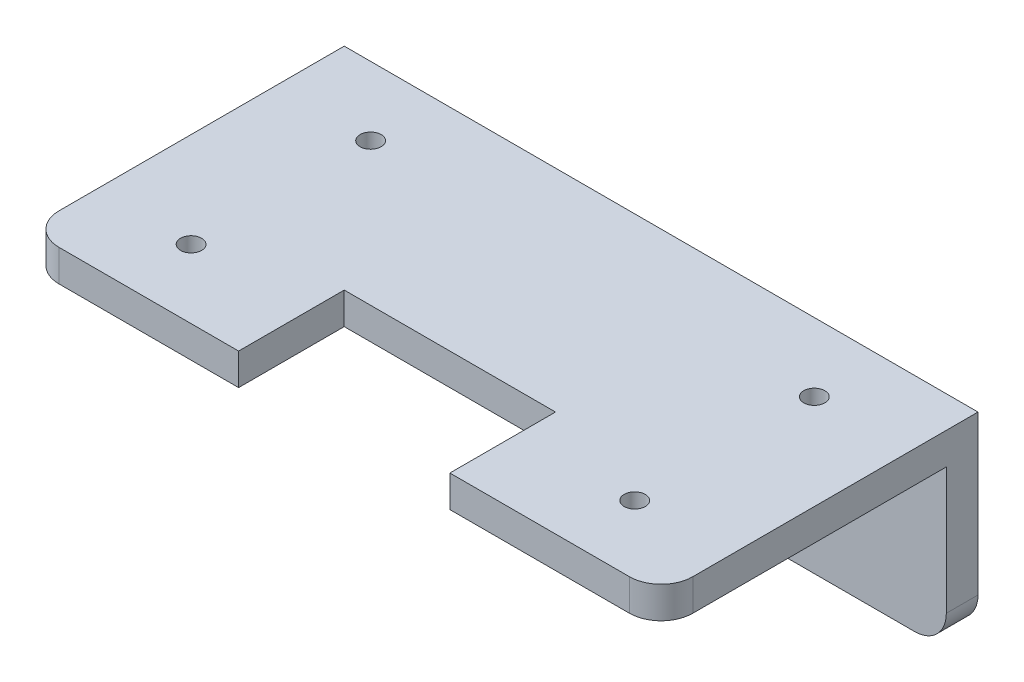
ISO-10303-21;
HEADER;
FILE_DESCRIPTION(('STEP AP214'),'2;1');
FILE_NAME('part.step','',(''),(''),'','','');
FILE_SCHEMA(('AUTOMOTIVE_DESIGN { 1 0 10303 214 1 1 1 1 }'));
ENDSEC;
DATA;
#1=APPLICATION_CONTEXT('core data for automotive mechanical design processes');
#2=APPLICATION_PROTOCOL_DEFINITION('international standard','automotive_design',2000,#1);
#3=PRODUCT_CONTEXT('',#1,'mechanical');
#4=PRODUCT('Part','Part','',(#3));
#5=PRODUCT_RELATED_PRODUCT_CATEGORY('part','',(#4));
#6=PRODUCT_DEFINITION_FORMATION('','',#4);
#7=PRODUCT_DEFINITION_CONTEXT('part definition',#1,'design');
#8=PRODUCT_DEFINITION('design','',#6,#7);
#9=PRODUCT_DEFINITION_SHAPE('','',#8);
#10=(LENGTH_UNIT() NAMED_UNIT(*) SI_UNIT(.MILLI.,.METRE.));
#11=(NAMED_UNIT(*) PLANE_ANGLE_UNIT() SI_UNIT($,.RADIAN.));
#12=(NAMED_UNIT(*) SI_UNIT($,.STERADIAN.) SOLID_ANGLE_UNIT());
#13=UNCERTAINTY_MEASURE_WITH_UNIT(LENGTH_MEASURE(1.E-05),#10,'distance_accuracy_value','');
#14=(GEOMETRIC_REPRESENTATION_CONTEXT(3) GLOBAL_UNCERTAINTY_ASSIGNED_CONTEXT((#13)) GLOBAL_UNIT_ASSIGNED_CONTEXT((#10,
#11,#12)) REPRESENTATION_CONTEXT('',''));
#15=CARTESIAN_POINT('',(0.,0.,0.));
#16=DIRECTION('',(0.,0.,1.));
#17=DIRECTION('',(1.,0.,0.));
#18=AXIS2_PLACEMENT_3D('',#15,#16,#17);
#19=CARTESIAN_POINT('',(0.,0.,30.));
#20=DIRECTION('',(0.,0.,1.));
#21=DIRECTION('',(1.,0.,0.));
#22=AXIS2_PLACEMENT_3D('',#19,#20,#21);
#23=PLANE('',#22);
#24=DIRECTION('',(-1.,0.,0.));
#25=VECTOR('',#24,1.);
#26=CARTESIAN_POINT('',(-30.,160.,30.));
#27=LINE('',#26,#25);
#28=CARTESIAN_POINT('',(-10.,160.,30.));
#29=VERTEX_POINT('',#28);
#30=CARTESIAN_POINT('',(-27.,160.,30.));
#31=VERTEX_POINT('',#30);
#32=EDGE_CURVE('E158',#29,#31,#27,.T.);
#33=ORIENTED_EDGE('',*,*,#32,.T.);
#34=DIRECTION('',(0.,-1.,0.));
#35=VECTOR('',#34,1.);
#36=CARTESIAN_POINT('',(-27.,157.,30.));
#37=LINE('',#36,#35);
#38=CARTESIAN_POINT('',(-27.,157.,30.));
#39=VERTEX_POINT('',#38);
#40=EDGE_CURVE('E11',#31,#39,#37,.T.);
#41=ORIENTED_EDGE('',*,*,#40,.T.);
#42=DIRECTION('',(1.,0.,0.));
#43=VECTOR('',#42,1.);
#44=CARTESIAN_POINT('',(-30.,157.,30.));
#45=LINE('',#44,#43);
#46=CARTESIAN_POINT('',(-10.,157.,30.));
#47=VERTEX_POINT('',#46);
#48=EDGE_CURVE('E192',#39,#47,#45,.T.);
#49=ORIENTED_EDGE('',*,*,#48,.T.);
#50=DIRECTION('',(0.,-1.,0.));
#51=VECTOR('',#50,1.);
#52=CARTESIAN_POINT('',(-10.,160.,30.));
#53=LINE('',#52,#51);
#54=EDGE_CURVE('E170',#29,#47,#53,.T.);
#55=ORIENTED_EDGE('',*,*,#54,.F.);
#56=EDGE_LOOP('',(#33,#41,#49,#55));
#57=FACE_BOUND('',#56,.T.);
#58=ADVANCED_FACE('F33',(#57),#23,.T.);
#59=CARTESIAN_POINT('',(-30.,157.,30.));
#60=DIRECTION('',(0.,1.,0.));
#61=DIRECTION('',(0.,0.,1.));
#62=AXIS2_PLACEMENT_3D('',#59,#60,#61);
#63=PLANE('',#62);
#64=CARTESIAN_POINT('',(21.,157.,23.4999999999984));
#65=DIRECTION('',(0.,1.,0.));
#66=DIRECTION('',(0.,0.,1.));
#67=AXIS2_PLACEMENT_3D('',#64,#65,#66);
#68=CIRCLE('',#67,0.999999999999998);
#69=CARTESIAN_POINT('',(21.,157.,24.4999999999984));
#70=VERTEX_POINT('',#69);
#71=EDGE_CURVE('E164',#70,#70,#68,.T.);
#72=ORIENTED_EDGE('',*,*,#71,.T.);
#73=EDGE_LOOP('',(#72));
#74=FACE_BOUND('',#73,.T.);
#75=CARTESIAN_POINT('',(21.,157.,6.49999999999844));
#76=DIRECTION('',(0.,1.,0.));
#77=DIRECTION('',(0.,0.,1.));
#78=AXIS2_PLACEMENT_3D('',#75,#76,#77);
#79=CIRCLE('',#78,1.);
#80=CARTESIAN_POINT('',(21.,157.,7.49999999999844));
#81=VERTEX_POINT('',#80);
#82=EDGE_CURVE('E351',#81,#81,#79,.T.);
#83=ORIENTED_EDGE('',*,*,#82,.T.);
#84=EDGE_LOOP('',(#83));
#85=FACE_BOUND('',#84,.T.);
#86=CARTESIAN_POINT('',(-21.,157.,6.49999999999841));
#87=DIRECTION('',(0.,1.,0.));
#88=DIRECTION('',(0.,0.,1.));
#89=AXIS2_PLACEMENT_3D('',#86,#87,#88);
#90=CIRCLE('',#89,1.);
#91=CARTESIAN_POINT('',(-21.,157.,7.49999999999842));
#92=VERTEX_POINT('',#91);
#93=EDGE_CURVE('E353',#92,#92,#90,.T.);
#94=ORIENTED_EDGE('',*,*,#93,.T.);
#95=EDGE_LOOP('',(#94));
#96=FACE_BOUND('',#95,.T.);
#97=CARTESIAN_POINT('',(-21.,157.,23.4999999999984));
#98=DIRECTION('',(0.,1.,0.));
#99=DIRECTION('',(0.,0.,1.));
#100=AXIS2_PLACEMENT_3D('',#97,#98,#99);
#101=CIRCLE('',#100,1.);
#102=CARTESIAN_POINT('',(-21.,157.,24.4999999999984));
#103=VERTEX_POINT('',#102);
#104=EDGE_CURVE('E356',#103,#103,#101,.T.);
#105=ORIENTED_EDGE('',*,*,#104,.T.);
#106=EDGE_LOOP('',(#105));
#107=FACE_BOUND('',#106,.T.);
#108=DIRECTION('',(0.,0.,-1.));
#109=VECTOR('',#108,1.);
#110=CARTESIAN_POINT('',(30.,157.,30.));
#111=LINE('',#110,#109);
#112=CARTESIAN_POINT('',(30.,157.,27.));
#113=VERTEX_POINT('',#112);
#114=CARTESIAN_POINT('',(30.,157.,3.));
#115=VERTEX_POINT('',#114);
#116=EDGE_CURVE('E209',#113,#115,#111,.T.);
#117=ORIENTED_EDGE('',*,*,#116,.F.);
#118=CARTESIAN_POINT('',(27.,157.,27.));
#119=DIRECTION('',(0.,1.,0.));
#120=DIRECTION('',(0.,0.,1.));
#121=AXIS2_PLACEMENT_3D('',#118,#119,#120);
#122=CIRCLE('',#121,3.);
#123=CARTESIAN_POINT('',(27.,157.,30.));
#124=VERTEX_POINT('',#123);
#125=EDGE_CURVE('E41',#113,#124,#122,.F.);
#126=ORIENTED_EDGE('',*,*,#125,.T.);
#127=CARTESIAN_POINT('',(10.,157.,30.));
#128=VERTEX_POINT('',#127);
#129=EDGE_CURVE('E194',#128,#124,#45,.T.);
#130=ORIENTED_EDGE('',*,*,#129,.F.);
#131=DIRECTION('',(0.,0.,1.));
#132=VECTOR('',#131,1.);
#133=CARTESIAN_POINT('',(10.,157.,30.));
#134=LINE('',#133,#132);
#135=CARTESIAN_POINT('',(10.,157.,20.));
#136=VERTEX_POINT('',#135);
#137=EDGE_CURVE('E159',#136,#128,#134,.T.);
#138=ORIENTED_EDGE('',*,*,#137,.F.);
#139=DIRECTION('',(1.,0.,0.));
#140=VECTOR('',#139,1.);
#141=CARTESIAN_POINT('',(-10.,157.,20.));
#142=LINE('',#141,#140);
#143=CARTESIAN_POINT('',(-10.,157.,20.));
#144=VERTEX_POINT('',#143);
#145=EDGE_CURVE('E161',#144,#136,#142,.T.);
#146=ORIENTED_EDGE('',*,*,#145,.F.);
#147=DIRECTION('',(0.,0.,-1.));
#148=VECTOR('',#147,1.);
#149=CARTESIAN_POINT('',(-10.,157.,30.));
#150=LINE('',#149,#148);
#151=EDGE_CURVE('E143',#47,#144,#150,.T.);
#152=ORIENTED_EDGE('',*,*,#151,.F.);
#153=ORIENTED_EDGE('',*,*,#48,.F.);
#154=CARTESIAN_POINT('',(-27.,157.,27.));
#155=DIRECTION('',(0.,1.,0.));
#156=DIRECTION('',(0.,0.,1.));
#157=AXIS2_PLACEMENT_3D('',#154,#155,#156);
#158=CIRCLE('',#157,3.);
#159=CARTESIAN_POINT('',(-30.,157.,27.));
#160=VERTEX_POINT('',#159);
#161=EDGE_CURVE('E48',#39,#160,#158,.F.);
#162=ORIENTED_EDGE('',*,*,#161,.T.);
#163=DIRECTION('',(0.,0.,-1.));
#164=VECTOR('',#163,1.);
#165=CARTESIAN_POINT('',(-30.,157.,30.));
#166=LINE('',#165,#164);
#167=CARTESIAN_POINT('',(-30.,157.,3.));
#168=VERTEX_POINT('',#167);
#169=EDGE_CURVE('E211',#160,#168,#166,.T.);
#170=ORIENTED_EDGE('',*,*,#169,.T.);
#171=DIRECTION('',(-1.,0.,0.));
#172=VECTOR('',#171,1.);
#173=CARTESIAN_POINT('',(-30.,157.,3.));
#174=LINE('',#173,#172);
#175=EDGE_CURVE('E172',#115,#168,#174,.T.);
#176=ORIENTED_EDGE('',*,*,#175,.F.);
#177=EDGE_LOOP('',(#117,#126,#130,#138,#146,#152,#153,#162,#170,#176));
#178=FACE_BOUND('',#177,.T.);
#179=ADVANCED_FACE('F246',(#74,#85,#96,#107,#178),#63,.F.);
#180=CARTESIAN_POINT('',(-30.,160.,30.));
#181=DIRECTION('',(1.,0.,0.));
#182=DIRECTION('',(0.,0.,-1.));
#183=AXIS2_PLACEMENT_3D('',#180,#181,#182);
#184=PLANE('',#183);
#185=DIRECTION('',(0.,-1.,0.));
#186=VECTOR('',#185,1.);
#187=CARTESIAN_POINT('',(-30.,160.,0.));
#188=LINE('',#187,#186);
#189=CARTESIAN_POINT('',(-30.,160.,0.));
#190=VERTEX_POINT('',#189);
#191=CARTESIAN_POINT('',(-30.,145.,0.));
#192=VERTEX_POINT('',#191);
#193=EDGE_CURVE('E191',#190,#192,#188,.T.);
#194=ORIENTED_EDGE('',*,*,#193,.T.);
#195=DIRECTION('',(0.,0.,-1.));
#196=VECTOR('',#195,1.);
#197=CARTESIAN_POINT('',(-30.,145.,30.));
#198=LINE('',#197,#196);
#199=CARTESIAN_POINT('',(-30.,145.,3.));
#200=VERTEX_POINT('',#199);
#201=EDGE_CURVE('E225',#192,#200,#198,.F.);
#202=ORIENTED_EDGE('',*,*,#201,.T.);
#203=DIRECTION('',(0.,1.,0.));
#204=VECTOR('',#203,1.);
#205=CARTESIAN_POINT('',(-30.,142.,3.));
#206=LINE('',#205,#204);
#207=EDGE_CURVE('E183',#200,#168,#206,.T.);
#208=ORIENTED_EDGE('',*,*,#207,.T.);
#209=ORIENTED_EDGE('',*,*,#169,.F.);
#210=DIRECTION('',(0.,-1.,0.));
#211=VECTOR('',#210,1.);
#212=CARTESIAN_POINT('',(-30.,160.,27.));
#213=LINE('',#212,#211);
#214=CARTESIAN_POINT('',(-30.,160.,27.));
#215=VERTEX_POINT('',#214);
#216=EDGE_CURVE('E223',#160,#215,#213,.F.);
#217=ORIENTED_EDGE('',*,*,#216,.T.);
#218=DIRECTION('',(0.,0.,-1.));
#219=VECTOR('',#218,1.);
#220=CARTESIAN_POINT('',(-30.,160.,30.));
#221=LINE('',#220,#219);
#222=EDGE_CURVE('E197',#215,#190,#221,.T.);
#223=ORIENTED_EDGE('',*,*,#222,.T.);
#224=EDGE_LOOP('',(#194,#202,#208,#209,#217,#223));
#225=FACE_BOUND('',#224,.T.);
#226=ADVANCED_FACE('F290',(#225),#184,.F.);
#227=CARTESIAN_POINT('',(30.,160.,30.));
#228=DIRECTION('',(-1.,0.,0.));
#229=DIRECTION('',(0.,0.,1.));
#230=AXIS2_PLACEMENT_3D('',#227,#228,#229);
#231=PLANE('',#230);
#232=DIRECTION('',(0.,1.,0.));
#233=VECTOR('',#232,1.);
#234=CARTESIAN_POINT('',(30.,142.,3.));
#235=LINE('',#234,#233);
#236=CARTESIAN_POINT('',(30.,145.,3.));
#237=VERTEX_POINT('',#236);
#238=EDGE_CURVE('E188',#237,#115,#235,.T.);
#239=ORIENTED_EDGE('',*,*,#238,.F.);
#240=DIRECTION('',(0.,0.,1.));
#241=VECTOR('',#240,1.);
#242=CARTESIAN_POINT('',(30.,145.,30.));
#243=LINE('',#242,#241);
#244=CARTESIAN_POINT('',(30.,145.,0.));
#245=VERTEX_POINT('',#244);
#246=EDGE_CURVE('E233',#237,#245,#243,.F.);
#247=ORIENTED_EDGE('',*,*,#246,.T.);
#248=DIRECTION('',(0.,1.,0.));
#249=VECTOR('',#248,1.);
#250=CARTESIAN_POINT('',(30.,160.,0.));
#251=LINE('',#250,#249);
#252=CARTESIAN_POINT('',(30.,160.,0.));
#253=VERTEX_POINT('',#252);
#254=EDGE_CURVE('E200',#245,#253,#251,.T.);
#255=ORIENTED_EDGE('',*,*,#254,.T.);
#256=DIRECTION('',(0.,0.,-1.));
#257=VECTOR('',#256,1.);
#258=CARTESIAN_POINT('',(30.,160.,30.));
#259=LINE('',#258,#257);
#260=CARTESIAN_POINT('',(30.,160.,27.));
#261=VERTEX_POINT('',#260);
#262=EDGE_CURVE('E207',#261,#253,#259,.T.);
#263=ORIENTED_EDGE('',*,*,#262,.F.);
#264=DIRECTION('',(0.,1.,0.));
#265=VECTOR('',#264,1.);
#266=CARTESIAN_POINT('',(30.,157.,27.));
#267=LINE('',#266,#265);
#268=EDGE_CURVE('E231',#261,#113,#267,.F.);
#269=ORIENTED_EDGE('',*,*,#268,.T.);
#270=ORIENTED_EDGE('',*,*,#116,.T.);
#271=EDGE_LOOP('',(#239,#247,#255,#263,#269,#270));
#272=FACE_BOUND('',#271,.T.);
#273=ADVANCED_FACE('F259',(#272),#231,.F.);
#274=CARTESIAN_POINT('',(-30.,160.,30.));
#275=DIRECTION('',(0.,-1.,0.));
#276=DIRECTION('',(0.,0.,-1.));
#277=AXIS2_PLACEMENT_3D('',#274,#275,#276);
#278=PLANE('',#277);
#279=CARTESIAN_POINT('',(21.,160.,23.4999999999984));
#280=DIRECTION('',(0.,1.,0.));
#281=DIRECTION('',(0.,0.,1.));
#282=AXIS2_PLACEMENT_3D('',#279,#280,#281);
#283=CIRCLE('',#282,0.999999999999998);
#284=CARTESIAN_POINT('',(21.,160.,24.4999999999984));
#285=VERTEX_POINT('',#284);
#286=EDGE_CURVE('E364',#285,#285,#283,.T.);
#287=ORIENTED_EDGE('',*,*,#286,.F.);
#288=EDGE_LOOP('',(#287));
#289=FACE_BOUND('',#288,.T.);
#290=CARTESIAN_POINT('',(21.,160.,6.49999999999844));
#291=DIRECTION('',(0.,1.,0.));
#292=DIRECTION('',(0.,0.,1.));
#293=AXIS2_PLACEMENT_3D('',#290,#291,#292);
#294=CIRCLE('',#293,1.);
#295=CARTESIAN_POINT('',(21.,160.,7.49999999999844));
#296=VERTEX_POINT('',#295);
#297=EDGE_CURVE('E348',#296,#296,#294,.T.);
#298=ORIENTED_EDGE('',*,*,#297,.F.);
#299=EDGE_LOOP('',(#298));
#300=FACE_BOUND('',#299,.T.);
#301=CARTESIAN_POINT('',(-21.,160.,6.49999999999841));
#302=DIRECTION('',(0.,1.,0.));
#303=DIRECTION('',(0.,0.,1.));
#304=AXIS2_PLACEMENT_3D('',#301,#302,#303);
#305=CIRCLE('',#304,1.);
#306=CARTESIAN_POINT('',(-21.,160.,7.49999999999842));
#307=VERTEX_POINT('',#306);
#308=EDGE_CURVE('E363',#307,#307,#305,.T.);
#309=ORIENTED_EDGE('',*,*,#308,.F.);
#310=EDGE_LOOP('',(#309));
#311=FACE_BOUND('',#310,.T.);
#312=CARTESIAN_POINT('',(-21.,160.,23.4999999999984));
#313=DIRECTION('',(0.,1.,0.));
#314=DIRECTION('',(0.,0.,1.));
#315=AXIS2_PLACEMENT_3D('',#312,#313,#314);
#316=CIRCLE('',#315,1.);
#317=CARTESIAN_POINT('',(-21.,160.,24.4999999999984));
#318=VERTEX_POINT('',#317);
#319=EDGE_CURVE('E361',#318,#318,#316,.T.);
#320=ORIENTED_EDGE('',*,*,#319,.F.);
#321=EDGE_LOOP('',(#320));
#322=FACE_BOUND('',#321,.T.);
#323=CARTESIAN_POINT('',(27.,160.,30.));
#324=VERTEX_POINT('',#323);
#325=CARTESIAN_POINT('',(10.,160.,30.));
#326=VERTEX_POINT('',#325);
#327=EDGE_CURVE('E195',#324,#326,#27,.T.);
#328=ORIENTED_EDGE('',*,*,#327,.F.);
#329=CARTESIAN_POINT('',(27.,160.,27.));
#330=DIRECTION('',(0.,-1.,0.));
#331=DIRECTION('',(0.,0.,-1.));
#332=AXIS2_PLACEMENT_3D('',#329,#330,#331);
#333=CIRCLE('',#332,3.);
#334=EDGE_CURVE('E239',#324,#261,#333,.F.);
#335=ORIENTED_EDGE('',*,*,#334,.T.);
#336=ORIENTED_EDGE('',*,*,#262,.T.);
#337=DIRECTION('',(-1.,0.,0.));
#338=VECTOR('',#337,1.);
#339=CARTESIAN_POINT('',(-30.,160.,0.));
#340=LINE('',#339,#338);
#341=EDGE_CURVE('E203',#253,#190,#340,.T.);
#342=ORIENTED_EDGE('',*,*,#341,.T.);
#343=ORIENTED_EDGE('',*,*,#222,.F.);
#344=CARTESIAN_POINT('',(-27.,160.,27.));
#345=DIRECTION('',(0.,-1.,0.));
#346=DIRECTION('',(0.,0.,-1.));
#347=AXIS2_PLACEMENT_3D('',#344,#345,#346);
#348=CIRCLE('',#347,3.);
#349=EDGE_CURVE('E55',#215,#31,#348,.F.);
#350=ORIENTED_EDGE('',*,*,#349,.T.);
#351=ORIENTED_EDGE('',*,*,#32,.F.);
#352=DIRECTION('',(0.,0.,-1.));
#353=VECTOR('',#352,1.);
#354=CARTESIAN_POINT('',(-10.,160.,30.));
#355=LINE('',#354,#353);
#356=CARTESIAN_POINT('',(-10.,160.,20.));
#357=VERTEX_POINT('',#356);
#358=EDGE_CURVE('E140',#29,#357,#355,.T.);
#359=ORIENTED_EDGE('',*,*,#358,.T.);
#360=DIRECTION('',(1.,0.,0.));
#361=VECTOR('',#360,1.);
#362=CARTESIAN_POINT('',(-10.,160.,20.));
#363=LINE('',#362,#361);
#364=CARTESIAN_POINT('',(10.,160.,20.));
#365=VERTEX_POINT('',#364);
#366=EDGE_CURVE('E151',#357,#365,#363,.T.);
#367=ORIENTED_EDGE('',*,*,#366,.T.);
#368=DIRECTION('',(0.,0.,1.));
#369=VECTOR('',#368,1.);
#370=CARTESIAN_POINT('',(10.,160.,30.));
#371=LINE('',#370,#369);
#372=EDGE_CURVE('E148',#365,#326,#371,.T.);
#373=ORIENTED_EDGE('',*,*,#372,.T.);
#374=EDGE_LOOP('',(#328,#335,#336,#342,#343,#350,#351,#359,#367,#373));
#375=FACE_BOUND('',#374,.T.);
#376=ADVANCED_FACE('F157',(#289,#300,#311,#322,#375),#278,.F.);
#377=ORIENTED_EDGE('',*,*,#129,.T.);
#378=DIRECTION('',(0.,1.,0.));
#379=VECTOR('',#378,1.);
#380=CARTESIAN_POINT('',(27.,160.,30.));
#381=LINE('',#380,#379);
#382=EDGE_CURVE('E235',#124,#324,#381,.T.);
#383=ORIENTED_EDGE('',*,*,#382,.T.);
#384=ORIENTED_EDGE('',*,*,#327,.T.);
#385=DIRECTION('',(0.,-1.,0.));
#386=VECTOR('',#385,1.);
#387=CARTESIAN_POINT('',(10.,160.,30.));
#388=LINE('',#387,#386);
#389=EDGE_CURVE('E173',#326,#128,#388,.T.);
#390=ORIENTED_EDGE('',*,*,#389,.T.);
#391=EDGE_LOOP('',(#377,#383,#384,#390));
#392=FACE_BOUND('',#391,.T.);
#393=ADVANCED_FACE('F253',(#392),#23,.T.);
#394=CARTESIAN_POINT('',(0.,0.,0.));
#395=DIRECTION('',(0.,0.,1.));
#396=DIRECTION('',(1.,0.,0.));
#397=AXIS2_PLACEMENT_3D('',#394,#395,#396);
#398=PLANE('',#397);
#399=DIRECTION('',(1.,0.,0.));
#400=VECTOR('',#399,1.);
#401=CARTESIAN_POINT('',(-30.,142.,0.));
#402=LINE('',#401,#400);
#403=CARTESIAN_POINT('',(-27.,142.,0.));
#404=VERTEX_POINT('',#403);
#405=CARTESIAN_POINT('',(27.,142.,0.));
#406=VERTEX_POINT('',#405);
#407=EDGE_CURVE('E177',#404,#406,#402,.T.);
#408=ORIENTED_EDGE('',*,*,#407,.F.);
#409=CARTESIAN_POINT('',(-27.,145.,0.));
#410=DIRECTION('',(0.,0.,1.));
#411=DIRECTION('',(1.,0.,0.));
#412=AXIS2_PLACEMENT_3D('',#409,#410,#411);
#413=CIRCLE('',#412,3.);
#414=EDGE_CURVE('E221',#404,#192,#413,.F.);
#415=ORIENTED_EDGE('',*,*,#414,.T.);
#416=ORIENTED_EDGE('',*,*,#193,.F.);
#417=ORIENTED_EDGE('',*,*,#341,.F.);
#418=ORIENTED_EDGE('',*,*,#254,.F.);
#419=CARTESIAN_POINT('',(27.,145.,0.));
#420=DIRECTION('',(0.,0.,1.));
#421=DIRECTION('',(1.,0.,0.));
#422=AXIS2_PLACEMENT_3D('',#419,#420,#421);
#423=CIRCLE('',#422,3.);
#424=EDGE_CURVE('E219',#245,#406,#423,.F.);
#425=ORIENTED_EDGE('',*,*,#424,.T.);
#426=EDGE_LOOP('',(#408,#415,#416,#417,#418,#425));
#427=FACE_BOUND('',#426,.T.);
#428=ADVANCED_FACE('F267',(#427),#398,.F.);
#429=CARTESIAN_POINT('',(-30.,142.,3.));
#430=DIRECTION('',(0.,0.,-1.));
#431=DIRECTION('',(-1.,0.,0.));
#432=AXIS2_PLACEMENT_3D('',#429,#430,#431);
#433=PLANE('',#432);
#434=ORIENTED_EDGE('',*,*,#207,.F.);
#435=CARTESIAN_POINT('',(-27.,145.,3.));
#436=DIRECTION('',(0.,0.,-1.));
#437=DIRECTION('',(-1.,0.,0.));
#438=AXIS2_PLACEMENT_3D('',#435,#436,#437);
#439=CIRCLE('',#438,3.);
#440=CARTESIAN_POINT('',(-27.,142.,3.));
#441=VERTEX_POINT('',#440);
#442=EDGE_CURVE('E229',#200,#441,#439,.F.);
#443=ORIENTED_EDGE('',*,*,#442,.T.);
#444=DIRECTION('',(-1.,0.,0.));
#445=VECTOR('',#444,1.);
#446=CARTESIAN_POINT('',(-30.,142.,3.));
#447=LINE('',#446,#445);
#448=CARTESIAN_POINT('',(27.,142.,3.));
#449=VERTEX_POINT('',#448);
#450=EDGE_CURVE('E180',#449,#441,#447,.T.);
#451=ORIENTED_EDGE('',*,*,#450,.F.);
#452=CARTESIAN_POINT('',(27.,145.,3.));
#453=DIRECTION('',(0.,0.,-1.));
#454=DIRECTION('',(-1.,0.,0.));
#455=AXIS2_PLACEMENT_3D('',#452,#453,#454);
#456=CIRCLE('',#455,3.);
#457=EDGE_CURVE('E227',#449,#237,#456,.F.);
#458=ORIENTED_EDGE('',*,*,#457,.T.);
#459=ORIENTED_EDGE('',*,*,#238,.T.);
#460=ORIENTED_EDGE('',*,*,#175,.T.);
#461=EDGE_LOOP('',(#434,#443,#451,#458,#459,#460));
#462=FACE_BOUND('',#461,.T.);
#463=ADVANCED_FACE('F300',(#462),#433,.F.);
#464=CARTESIAN_POINT('',(0.,142.,0.));
#465=DIRECTION('',(0.,1.,0.));
#466=DIRECTION('',(0.,0.,1.));
#467=AXIS2_PLACEMENT_3D('',#464,#465,#466);
#468=PLANE('',#467);
#469=ORIENTED_EDGE('',*,*,#450,.T.);
#470=DIRECTION('',(0.,0.,-1.));
#471=VECTOR('',#470,1.);
#472=CARTESIAN_POINT('',(-27.,142.,0.));
#473=LINE('',#472,#471);
#474=EDGE_CURVE('E216',#441,#404,#473,.T.);
#475=ORIENTED_EDGE('',*,*,#474,.T.);
#476=ORIENTED_EDGE('',*,*,#407,.T.);
#477=DIRECTION('',(0.,0.,1.));
#478=VECTOR('',#477,1.);
#479=CARTESIAN_POINT('',(27.,142.,0.));
#480=LINE('',#479,#478);
#481=EDGE_CURVE('E213',#406,#449,#480,.T.);
#482=ORIENTED_EDGE('',*,*,#481,.T.);
#483=EDGE_LOOP('',(#469,#475,#476,#482));
#484=FACE_BOUND('',#483,.T.);
#485=ADVANCED_FACE('F282',(#484),#468,.F.);
#486=CARTESIAN_POINT('',(-10.,160.,30.));
#487=DIRECTION('',(-1.,0.,0.));
#488=DIRECTION('',(0.,0.,1.));
#489=AXIS2_PLACEMENT_3D('',#486,#487,#488);
#490=PLANE('',#489);
#491=ORIENTED_EDGE('',*,*,#151,.T.);
#492=DIRECTION('',(0.,-1.,0.));
#493=VECTOR('',#492,1.);
#494=CARTESIAN_POINT('',(-10.,160.,20.));
#495=LINE('',#494,#493);
#496=EDGE_CURVE('E135',#357,#144,#495,.T.);
#497=ORIENTED_EDGE('',*,*,#496,.F.);
#498=ORIENTED_EDGE('',*,*,#358,.F.);
#499=ORIENTED_EDGE('',*,*,#54,.T.);
#500=EDGE_LOOP('',(#491,#497,#498,#499));
#501=FACE_BOUND('',#500,.T.);
#502=ADVANCED_FACE('F137',(#501),#490,.F.);
#503=CARTESIAN_POINT('',(10.,160.,30.));
#504=DIRECTION('',(1.,0.,0.));
#505=DIRECTION('',(0.,0.,-1.));
#506=AXIS2_PLACEMENT_3D('',#503,#504,#505);
#507=PLANE('',#506);
#508=ORIENTED_EDGE('',*,*,#137,.T.);
#509=ORIENTED_EDGE('',*,*,#389,.F.);
#510=ORIENTED_EDGE('',*,*,#372,.F.);
#511=DIRECTION('',(0.,-1.,0.));
#512=VECTOR('',#511,1.);
#513=CARTESIAN_POINT('',(10.,160.,20.));
#514=LINE('',#513,#512);
#515=EDGE_CURVE('E147',#365,#136,#514,.T.);
#516=ORIENTED_EDGE('',*,*,#515,.T.);
#517=EDGE_LOOP('',(#508,#509,#510,#516));
#518=FACE_BOUND('',#517,.T.);
#519=ADVANCED_FACE('F273',(#518),#507,.F.);
#520=CARTESIAN_POINT('',(-10.,160.,20.));
#521=DIRECTION('',(0.,0.,-1.));
#522=DIRECTION('',(-1.,0.,0.));
#523=AXIS2_PLACEMENT_3D('',#520,#521,#522);
#524=PLANE('',#523);
#525=ORIENTED_EDGE('',*,*,#145,.T.);
#526=ORIENTED_EDGE('',*,*,#515,.F.);
#527=ORIENTED_EDGE('',*,*,#366,.F.);
#528=ORIENTED_EDGE('',*,*,#496,.T.);
#529=EDGE_LOOP('',(#525,#526,#527,#528));
#530=FACE_BOUND('',#529,.T.);
#531=ADVANCED_FACE('F152',(#530),#524,.F.);
#532=CARTESIAN_POINT('',(-27.,145.,0.));
#533=DIRECTION('',(0.,0.,-1.));
#534=DIRECTION('',(-1.,0.,0.));
#535=AXIS2_PLACEMENT_3D('',#532,#533,#534);
#536=CYLINDRICAL_SURFACE('',#535,3.);
#537=ORIENTED_EDGE('',*,*,#442,.F.);
#538=ORIENTED_EDGE('',*,*,#201,.F.);
#539=ORIENTED_EDGE('',*,*,#414,.F.);
#540=ORIENTED_EDGE('',*,*,#474,.F.);
#541=EDGE_LOOP('',(#537,#538,#539,#540));
#542=FACE_BOUND('',#541,.T.);
#543=ADVANCED_FACE('F280',(#542),#536,.T.);
#544=CARTESIAN_POINT('',(27.,145.,0.));
#545=DIRECTION('',(0.,0.,1.));
#546=DIRECTION('',(1.,0.,0.));
#547=AXIS2_PLACEMENT_3D('',#544,#545,#546);
#548=CYLINDRICAL_SURFACE('',#547,3.);
#549=ORIENTED_EDGE('',*,*,#424,.F.);
#550=ORIENTED_EDGE('',*,*,#246,.F.);
#551=ORIENTED_EDGE('',*,*,#457,.F.);
#552=ORIENTED_EDGE('',*,*,#481,.F.);
#553=EDGE_LOOP('',(#549,#550,#551,#552));
#554=FACE_BOUND('',#553,.T.);
#555=ADVANCED_FACE('F314',(#554),#548,.T.);
#556=CARTESIAN_POINT('',(27.,0.,27.));
#557=DIRECTION('',(0.,-1.,0.));
#558=DIRECTION('',(0.,0.,-1.));
#559=AXIS2_PLACEMENT_3D('',#556,#557,#558);
#560=CYLINDRICAL_SURFACE('',#559,3.);
#561=ORIENTED_EDGE('',*,*,#125,.F.);
#562=ORIENTED_EDGE('',*,*,#268,.F.);
#563=ORIENTED_EDGE('',*,*,#334,.F.);
#564=ORIENTED_EDGE('',*,*,#382,.F.);
#565=EDGE_LOOP('',(#561,#562,#563,#564));
#566=FACE_BOUND('',#565,.T.);
#567=ADVANCED_FACE('F255',(#566),#560,.T.);
#568=CARTESIAN_POINT('',(-27.,0.,27.));
#569=DIRECTION('',(0.,1.,0.));
#570=DIRECTION('',(0.,0.,1.));
#571=AXIS2_PLACEMENT_3D('',#568,#569,#570);
#572=CYLINDRICAL_SURFACE('',#571,3.);
#573=ORIENTED_EDGE('',*,*,#349,.F.);
#574=ORIENTED_EDGE('',*,*,#216,.F.);
#575=ORIENTED_EDGE('',*,*,#161,.F.);
#576=ORIENTED_EDGE('',*,*,#40,.F.);
#577=EDGE_LOOP('',(#573,#574,#575,#576));
#578=FACE_BOUND('',#577,.T.);
#579=ADVANCED_FACE('F35',(#578),#572,.T.);
#580=CARTESIAN_POINT('',(-21.,150.,23.4999999999984));
#581=DIRECTION('',(0.,1.,0.));
#582=DIRECTION('',(0.,0.,1.));
#583=AXIS2_PLACEMENT_3D('',#580,#581,#582);
#584=CYLINDRICAL_SURFACE('',#583,1.);
#585=ORIENTED_EDGE('',*,*,#319,.T.);
#586=EDGE_LOOP('',(#585));
#587=FACE_BOUND('',#586,.T.);
#588=ORIENTED_EDGE('',*,*,#104,.F.);
#589=EDGE_LOOP('',(#588));
#590=FACE_BOUND('',#589,.T.);
#591=ADVANCED_FACE('F322',(#587,#590),#584,.F.);
#592=CARTESIAN_POINT('',(-21.,150.,6.49999999999841));
#593=DIRECTION('',(0.,1.,0.));
#594=DIRECTION('',(0.,0.,1.));
#595=AXIS2_PLACEMENT_3D('',#592,#593,#594);
#596=CYLINDRICAL_SURFACE('',#595,1.);
#597=ORIENTED_EDGE('',*,*,#308,.T.);
#598=EDGE_LOOP('',(#597));
#599=FACE_BOUND('',#598,.T.);
#600=ORIENTED_EDGE('',*,*,#93,.F.);
#601=EDGE_LOOP('',(#600));
#602=FACE_BOUND('',#601,.T.);
#603=ADVANCED_FACE('F326',(#599,#602),#596,.F.);
#604=CARTESIAN_POINT('',(21.,150.,6.49999999999844));
#605=DIRECTION('',(0.,1.,0.));
#606=DIRECTION('',(0.,0.,1.));
#607=AXIS2_PLACEMENT_3D('',#604,#605,#606);
#608=CYLINDRICAL_SURFACE('',#607,1.);
#609=ORIENTED_EDGE('',*,*,#297,.T.);
#610=EDGE_LOOP('',(#609));
#611=FACE_BOUND('',#610,.T.);
#612=ORIENTED_EDGE('',*,*,#82,.F.);
#613=EDGE_LOOP('',(#612));
#614=FACE_BOUND('',#613,.T.);
#615=ADVANCED_FACE('F331',(#611,#614),#608,.F.);
#616=CARTESIAN_POINT('',(21.,150.,23.4999999999984));
#617=DIRECTION('',(0.,1.,0.));
#618=DIRECTION('',(0.,0.,1.));
#619=AXIS2_PLACEMENT_3D('',#616,#617,#618);
#620=CYLINDRICAL_SURFACE('',#619,0.999999999999998);
#621=ORIENTED_EDGE('',*,*,#286,.T.);
#622=EDGE_LOOP('',(#621));
#623=FACE_BOUND('',#622,.T.);
#624=ORIENTED_EDGE('',*,*,#71,.F.);
#625=EDGE_LOOP('',(#624));
#626=FACE_BOUND('',#625,.T.);
#627=ADVANCED_FACE('F337',(#623,#626),#620,.F.);
#628=CLOSED_SHELL('',(#58,#179,#226,#273,#376,#393,#428,#463,#485,#502,#519,#531,#543,#555,#567,
#579,#591,#603,#615,#627));
#629=MANIFOLD_SOLID_BREP('B2',#628);
#630=ADVANCED_BREP_SHAPE_REPRESENTATION('',(#18,#629),#14);
#631=SHAPE_DEFINITION_REPRESENTATION(#9,#630);
ENDSEC;
END-ISO-10303-21;
